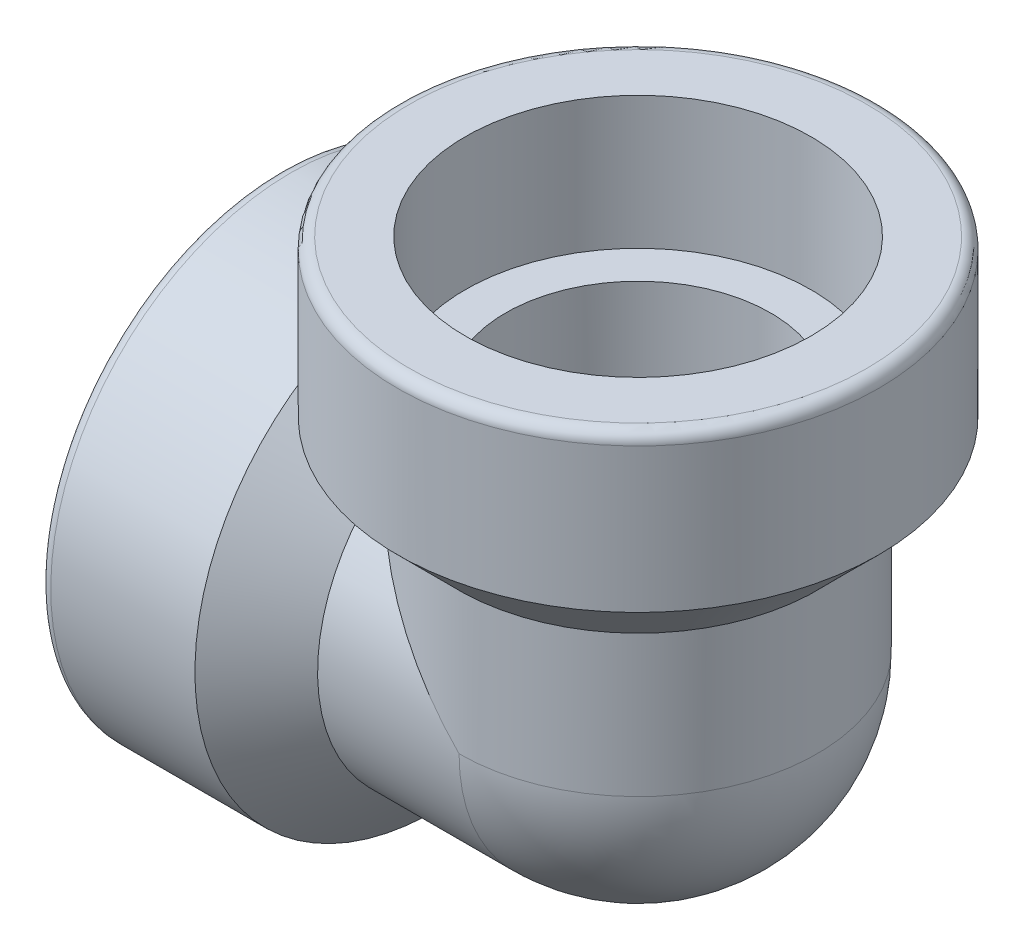
ISO-10303-21;
HEADER;
FILE_DESCRIPTION(('STEP AP214'),'2;1');
FILE_NAME('part.step','',(''),(''),'','','');
FILE_SCHEMA(('AUTOMOTIVE_DESIGN { 1 0 10303 214 1 1 1 1 }'));
ENDSEC;
DATA;
#1=APPLICATION_CONTEXT('core data for automotive mechanical design processes');
#2=APPLICATION_PROTOCOL_DEFINITION('international standard','automotive_design',2000,#1);
#3=PRODUCT_CONTEXT('',#1,'mechanical');
#4=PRODUCT('Part','Part','',(#3));
#5=PRODUCT_RELATED_PRODUCT_CATEGORY('part','',(#4));
#6=PRODUCT_DEFINITION_FORMATION('','',#4);
#7=PRODUCT_DEFINITION_CONTEXT('part definition',#1,'design');
#8=PRODUCT_DEFINITION('design','',#6,#7);
#9=PRODUCT_DEFINITION_SHAPE('','',#8);
#10=(LENGTH_UNIT() NAMED_UNIT(*) SI_UNIT(.MILLI.,.METRE.));
#11=(NAMED_UNIT(*) PLANE_ANGLE_UNIT() SI_UNIT($,.RADIAN.));
#12=(NAMED_UNIT(*) SI_UNIT($,.STERADIAN.) SOLID_ANGLE_UNIT());
#13=UNCERTAINTY_MEASURE_WITH_UNIT(LENGTH_MEASURE(1.E-05),#10,'distance_accuracy_value','');
#14=(GEOMETRIC_REPRESENTATION_CONTEXT(3) GLOBAL_UNCERTAINTY_ASSIGNED_CONTEXT((#13)) GLOBAL_UNIT_ASSIGNED_CONTEXT((#10,
#11,#12)) REPRESENTATION_CONTEXT('',''));
#15=CARTESIAN_POINT('',(0.,0.,0.));
#16=DIRECTION('',(0.,0.,1.));
#17=DIRECTION('',(1.,0.,0.));
#18=AXIS2_PLACEMENT_3D('',#15,#16,#17);
#19=CARTESIAN_POINT('',(0.,0.,0.));
#20=DIRECTION('',(1.,0.,0.));
#21=DIRECTION('',(0.,1.,0.));
#22=AXIS2_PLACEMENT_3D('',#19,#20,#21);
#23=CYLINDRICAL_SURFACE('',#22,23.495);
#24=CARTESIAN_POINT('',(-33.91535,0.,0.));
#25=DIRECTION('',(1.,0.,0.));
#26=DIRECTION('',(0.,1.,0.));
#27=AXIS2_PLACEMENT_3D('',#24,#25,#26);
#28=CIRCLE('',#27,23.495);
#29=CARTESIAN_POINT('',(-33.91535,23.495,0.));
#30=VERTEX_POINT('',#29);
#31=EDGE_CURVE('E232',#30,#30,#28,.T.);
#32=ORIENTED_EDGE('',*,*,#31,.T.);
#33=EDGE_LOOP('',(#32));
#34=FACE_BOUND('',#33,.T.);
#35=CARTESIAN_POINT('',(0.,0.,0.));
#36=DIRECTION('',(0.707106781186549,0.707106781186546,0.));
#37=DIRECTION('',(0.707106781186546,-0.707106781186549,0.));
#38=AXIS2_PLACEMENT_3D('',#35,#36,#37);
#39=ELLIPSE('',#38,33.2269476479558,23.495);
#40=CARTESIAN_POINT('',(-19.8247,19.8247,-12.6093732956875));
#41=VERTEX_POINT('',#40);
#42=CARTESIAN_POINT('',(-19.8247,19.824700000002,12.6093732956845));
#43=VERTEX_POINT('',#42);
#44=EDGE_CURVE('E98',#41,#43,#39,.T.);
#45=ORIENTED_EDGE('',*,*,#44,.F.);
#46=CARTESIAN_POINT('',(-19.8247,0.,0.));
#47=DIRECTION('',(1.,0.,0.));
#48=DIRECTION('',(0.,1.,0.));
#49=AXIS2_PLACEMENT_3D('',#46,#47,#48);
#50=CIRCLE('',#49,23.495);
#51=EDGE_CURVE('E235',#43,#41,#50,.T.);
#52=ORIENTED_EDGE('',*,*,#51,.F.);
#53=EDGE_LOOP('',(#45,#52));
#54=FACE_BOUND('',#53,.T.);
#55=ADVANCED_FACE('F84',(#34,#54),#23,.T.);
#56=CARTESIAN_POINT('',(-19.8247,0.,0.));
#57=DIRECTION('',(-1.,0.,0.));
#58=DIRECTION('',(0.,-1.,0.));
#59=AXIS2_PLACEMENT_3D('',#56,#57,#58);
#60=CONICAL_SURFACE('',#59,23.495,0.78539816339745);
#61=CARTESIAN_POINT('',(-13.8301,13.8301000000001,-10.7234478667077));
#62=CARTESIAN_POINT('',(-14.3275758626106,14.3275758626106,-10.8936867187958));
#63=CARTESIAN_POINT('',(-14.8256908691402,14.8256908691402,-11.0601533383311));
#64=CARTESIAN_POINT('',(-15.8229909550341,15.8229909550341,-11.3863126626173));
#65=CARTESIAN_POINT('',(-16.3221759531859,16.3221759531859,-11.5460058635909));
#66=CARTESIAN_POINT('',(-17.3214680583137,17.3214680583137,-11.8594096385888));
#67=CARTESIAN_POINT('',(-17.8215751413089,17.8215751413089,-12.0131203659639));
#68=CARTESIAN_POINT('',(-18.8226394264934,18.8226394264934,-12.315164638502));
#69=CARTESIAN_POINT('',(-19.3235966882929,19.3235966882929,-12.4634977888065));
#70=CARTESIAN_POINT('',(-19.8249000000001,19.8249000000001,-12.6094315109761));
#71=B_SPLINE_CURVE_WITH_KNOTS('',3,(#61,#62,#63,#64,#65,#66,#67,#68,#69,#70),.UNSPECIFIED.,.F.,
.F.,(4,2,2,2,4),(0.,2.17150001962585,4.34284067873014,6.51412564241125,8.6855697150797),.UNSPECIFIED.);
#72=CARTESIAN_POINT('',(-13.8303,13.8303,-10.7235163202188));
#73=VERTEX_POINT('',#72);
#74=EDGE_CURVE('E169',#73,#41,#71,.T.);
#75=ORIENTED_EDGE('',*,*,#74,.F.);
#76=CARTESIAN_POINT('',(-13.8303,0.,0.));
#77=DIRECTION('',(1.,0.,0.));
#78=DIRECTION('',(0.,1.,0.));
#79=AXIS2_PLACEMENT_3D('',#76,#77,#78);
#80=CIRCLE('',#79,17.5006);
#81=CARTESIAN_POINT('',(-13.8303,13.8303,10.7235163202188));
#82=VERTEX_POINT('',#81);
#83=EDGE_CURVE('E143',#82,#73,#80,.T.);
#84=ORIENTED_EDGE('',*,*,#83,.F.);
#85=CARTESIAN_POINT('',(-19.8249000000001,19.8249000000001,12.6094315109761));
#86=CARTESIAN_POINT('',(-19.3235966882929,19.3235966882929,12.4634977888065));
#87=CARTESIAN_POINT('',(-18.8226394264934,18.8226394264935,12.315164638502));
#88=CARTESIAN_POINT('',(-17.8215751413089,17.8215751413089,12.0131203659639));
#89=CARTESIAN_POINT('',(-17.3214680583137,17.3214680583137,11.8594096385888));
#90=CARTESIAN_POINT('',(-16.3221759531859,16.3221759531859,11.5460058635909));
#91=CARTESIAN_POINT('',(-15.8229909550341,15.8229909550341,11.3863126626172));
#92=CARTESIAN_POINT('',(-14.8256908691402,14.8256908691402,11.0601533383311));
#93=CARTESIAN_POINT('',(-14.3275758626106,14.3275758626106,10.8936867187958));
#94=CARTESIAN_POINT('',(-13.8301,13.8301000000001,10.7234478667077));
#95=B_SPLINE_CURVE_WITH_KNOTS('',3,(#85,#86,#87,#88,#89,#90,#91,#92,#93,#94),.UNSPECIFIED.,.F.,
.F.,(4,2,2,2,4),(0.,2.17144407266845,4.34272903634957,6.51406969545385,8.68556971507971),.UNSPECIFIED.);
#96=EDGE_CURVE('E105',#43,#82,#95,.T.);
#97=ORIENTED_EDGE('',*,*,#96,.F.);
#98=ORIENTED_EDGE('',*,*,#51,.T.);
#99=EDGE_LOOP('',(#75,#84,#97,#98));
#100=FACE_BOUND('',#99,.T.);
#101=ADVANCED_FACE('F174',(#100),#60,.T.);
#102=CARTESIAN_POINT('',(0.,0.,0.));
#103=DIRECTION('',(1.,0.,0.));
#104=DIRECTION('',(0.,1.,0.));
#105=AXIS2_PLACEMENT_3D('',#102,#103,#104);
#106=CYLINDRICAL_SURFACE('',#105,17.5006);
#107=CARTESIAN_POINT('',(0.,0.,0.));
#108=DIRECTION('',(0.707106781186549,0.707106781186546,0.));
#109=DIRECTION('',(0.707106781186546,-0.707106781186549,0.));
#110=AXIS2_PLACEMENT_3D('',#107,#108,#109);
#111=ELLIPSE('',#110,24.7495858696665,17.5006);
#112=CARTESIAN_POINT('',(0.,0.,-17.5006));
#113=VERTEX_POINT('',#112);
#114=EDGE_CURVE('E137',#113,#73,#111,.T.);
#115=ORIENTED_EDGE('',*,*,#114,.F.);
#116=CARTESIAN_POINT('',(0.,0.,0.));
#117=DIRECTION('',(1.,0.,0.));
#118=DIRECTION('',(0.,1.,0.));
#119=AXIS2_PLACEMENT_3D('',#116,#117,#118);
#120=CIRCLE('',#119,17.5006);
#121=CARTESIAN_POINT('',(0.,0.,17.5006));
#122=VERTEX_POINT('',#121);
#123=EDGE_CURVE('E140',#122,#113,#120,.T.);
#124=ORIENTED_EDGE('',*,*,#123,.F.);
#125=EDGE_CURVE('E126',#82,#122,#111,.T.);
#126=ORIENTED_EDGE('',*,*,#125,.F.);
#127=ORIENTED_EDGE('',*,*,#83,.T.);
#128=EDGE_LOOP('',(#115,#124,#126,#127));
#129=FACE_BOUND('',#128,.T.);
#130=ADVANCED_FACE('F141',(#129),#106,.T.);
#131=CARTESIAN_POINT('',(-35.052,-16.891,0.));
#132=DIRECTION('',(1.,0.,0.));
#133=DIRECTION('',(0.,1.,0.));
#134=AXIS2_PLACEMENT_3D('',#131,#132,#133);
#135=PLANE('',#134);
#136=CARTESIAN_POINT('',(-35.052,0.,0.));
#137=DIRECTION('',(1.,0.,0.));
#138=DIRECTION('',(0.,1.,0.));
#139=AXIS2_PLACEMENT_3D('',#136,#137,#138);
#140=CIRCLE('',#139,22.35835);
#141=CARTESIAN_POINT('',(-35.052,22.35835,0.));
#142=VERTEX_POINT('',#141);
#143=EDGE_CURVE('E92',#142,#142,#140,.T.);
#144=ORIENTED_EDGE('',*,*,#143,.F.);
#145=EDGE_LOOP('',(#144));
#146=FACE_BOUND('',#145,.T.);
#147=CARTESIAN_POINT('',(-35.052,0.,0.));
#148=DIRECTION('',(1.,0.,0.));
#149=DIRECTION('',(0.,1.,0.));
#150=AXIS2_PLACEMENT_3D('',#147,#148,#149);
#151=CIRCLE('',#150,16.891);
#152=CARTESIAN_POINT('',(-35.052,16.891,0.));
#153=VERTEX_POINT('',#152);
#154=EDGE_CURVE('E248',#153,#153,#151,.T.);
#155=ORIENTED_EDGE('',*,*,#154,.T.);
#156=EDGE_LOOP('',(#155));
#157=FACE_BOUND('',#156,.T.);
#158=ADVANCED_FACE('F86',(#146,#157),#135,.F.);
#159=CARTESIAN_POINT('',(-33.91535,0.,0.));
#160=DIRECTION('',(1.,0.,0.));
#161=DIRECTION('',(0.,1.,0.));
#162=AXIS2_PLACEMENT_3D('',#159,#160,#161);
#163=TOROIDAL_SURFACE('',#162,22.35835,1.13665000000001);
#164=ORIENTED_EDGE('',*,*,#31,.F.);
#165=EDGE_LOOP('',(#164));
#166=FACE_BOUND('',#165,.T.);
#167=ORIENTED_EDGE('',*,*,#143,.T.);
#168=EDGE_LOOP('',(#167));
#169=FACE_BOUND('',#168,.T.);
#170=ADVANCED_FACE('F213',(#166,#169),#163,.T.);
#171=CARTESIAN_POINT('',(0.,0.,0.));
#172=DIRECTION('',(1.,0.,0.));
#173=DIRECTION('',(0.,1.,0.));
#174=AXIS2_PLACEMENT_3D('',#171,#172,#173);
#175=CYLINDRICAL_SURFACE('',#174,12.954);
#176=CARTESIAN_POINT('',(0.,0.,0.));
#177=DIRECTION('',(0.707106781186549,0.707106781186546,0.));
#178=DIRECTION('',(0.707106781186546,-0.707106781186549,0.));
#179=AXIS2_PLACEMENT_3D('',#176,#177,#178);
#180=ELLIPSE('',#179,18.319722486981,12.954);
#181=CARTESIAN_POINT('',(0.,0.,-12.954));
#182=VERTEX_POINT('',#181);
#183=CARTESIAN_POINT('',(0.,0.,12.954));
#184=VERTEX_POINT('',#183);
#185=EDGE_CURVE('E12',#182,#184,#180,.T.);
#186=ORIENTED_EDGE('',*,*,#185,.T.);
#187=CARTESIAN_POINT('',(0.,0.,0.));
#188=DIRECTION('',(1.,0.,0.));
#189=DIRECTION('',(0.,1.,0.));
#190=AXIS2_PLACEMENT_3D('',#187,#188,#189);
#191=CIRCLE('',#190,12.954);
#192=EDGE_CURVE('E144',#184,#182,#191,.T.);
#193=ORIENTED_EDGE('',*,*,#192,.T.);
#194=EDGE_LOOP('',(#186,#193));
#195=FACE_BOUND('',#194,.T.);
#196=CARTESIAN_POINT('',(-22.098,0.,0.));
#197=DIRECTION('',(1.,0.,0.));
#198=DIRECTION('',(0.,1.,0.));
#199=AXIS2_PLACEMENT_3D('',#196,#197,#198);
#200=CIRCLE('',#199,12.954);
#201=CARTESIAN_POINT('',(-22.098,12.954,0.));
#202=VERTEX_POINT('',#201);
#203=EDGE_CURVE('E242',#202,#202,#200,.T.);
#204=ORIENTED_EDGE('',*,*,#203,.F.);
#205=EDGE_LOOP('',(#204));
#206=FACE_BOUND('',#205,.T.);
#207=ADVANCED_FACE('F210',(#195,#206),#175,.F.);
#208=CARTESIAN_POINT('',(-22.098,-16.891,0.));
#209=DIRECTION('',(1.,0.,0.));
#210=DIRECTION('',(0.,1.,0.));
#211=AXIS2_PLACEMENT_3D('',#208,#209,#210);
#212=PLANE('',#211);
#213=CARTESIAN_POINT('',(-22.098,0.,0.));
#214=DIRECTION('',(1.,0.,0.));
#215=DIRECTION('',(0.,1.,0.));
#216=AXIS2_PLACEMENT_3D('',#213,#214,#215);
#217=CIRCLE('',#216,16.891);
#218=CARTESIAN_POINT('',(-22.098,16.891,0.));
#219=VERTEX_POINT('',#218);
#220=EDGE_CURVE('E245',#219,#219,#217,.T.);
#221=ORIENTED_EDGE('',*,*,#220,.F.);
#222=EDGE_LOOP('',(#221));
#223=FACE_BOUND('',#222,.T.);
#224=ORIENTED_EDGE('',*,*,#203,.T.);
#225=EDGE_LOOP('',(#224));
#226=FACE_BOUND('',#225,.T.);
#227=ADVANCED_FACE('F206',(#223,#226),#212,.F.);
#228=CARTESIAN_POINT('',(0.,0.,0.));
#229=DIRECTION('',(1.,0.,0.));
#230=DIRECTION('',(0.,1.,0.));
#231=AXIS2_PLACEMENT_3D('',#228,#229,#230);
#232=CYLINDRICAL_SURFACE('',#231,16.891);
#233=ORIENTED_EDGE('',*,*,#154,.F.);
#234=EDGE_LOOP('',(#233));
#235=FACE_BOUND('',#234,.T.);
#236=ORIENTED_EDGE('',*,*,#220,.T.);
#237=EDGE_LOOP('',(#236));
#238=FACE_BOUND('',#237,.T.);
#239=ADVANCED_FACE('F202',(#235,#238),#232,.F.);
#240=CARTESIAN_POINT('',(1.16888437002832E-13,35.052,0.));
#241=DIRECTION('',(0.,-1.,0.));
#242=DIRECTION('',(1.,0.,0.));
#243=AXIS2_PLACEMENT_3D('',#240,#241,#242);
#244=CYLINDRICAL_SURFACE('',#243,12.954);
#245=ORIENTED_EDGE('',*,*,#185,.F.);
#246=CARTESIAN_POINT('',(0.,0.,0.));
#247=DIRECTION('',(0.,-1.,0.));
#248=DIRECTION('',(1.,0.,0.));
#249=AXIS2_PLACEMENT_3D('',#246,#247,#248);
#250=CIRCLE('',#249,12.954);
#251=EDGE_CURVE('E147',#182,#184,#250,.T.);
#252=ORIENTED_EDGE('',*,*,#251,.T.);
#253=EDGE_LOOP('',(#245,#252));
#254=FACE_BOUND('',#253,.T.);
#255=CARTESIAN_POINT('',(0.,22.098,0.));
#256=DIRECTION('',(0.,-1.,0.));
#257=DIRECTION('',(1.,0.,0.));
#258=AXIS2_PLACEMENT_3D('',#255,#256,#257);
#259=CIRCLE('',#258,12.954);
#260=CARTESIAN_POINT('',(12.9540000000001,22.0979999999999,0.));
#261=VERTEX_POINT('',#260);
#262=EDGE_CURVE('E152',#261,#261,#259,.T.);
#263=ORIENTED_EDGE('',*,*,#262,.F.);
#264=EDGE_LOOP('',(#263));
#265=FACE_BOUND('',#264,.T.);
#266=ADVANCED_FACE('F189',(#254,#265),#244,.F.);
#267=CARTESIAN_POINT('',(0.,0.,0.));
#268=DIRECTION('',(0.,-1.,0.));
#269=DIRECTION('',(1.,0.,0.));
#270=AXIS2_PLACEMENT_3D('',#267,#268,#269);
#271=CYLINDRICAL_SURFACE('',#270,23.495);
#272=CARTESIAN_POINT('',(1.14036436495777E-13,33.91535,0.));
#273=DIRECTION('',(0.,-1.,0.));
#274=DIRECTION('',(1.,0.,0.));
#275=AXIS2_PLACEMENT_3D('',#272,#273,#274);
#276=CIRCLE('',#275,23.495);
#277=CARTESIAN_POINT('',(23.4950000000001,33.9153499999999,0.));
#278=VERTEX_POINT('',#277);
#279=EDGE_CURVE('E158',#278,#278,#276,.T.);
#280=ORIENTED_EDGE('',*,*,#279,.T.);
#281=EDGE_LOOP('',(#280));
#282=FACE_BOUND('',#281,.T.);
#283=CARTESIAN_POINT('',(0.,19.8247,0.));
#284=DIRECTION('',(0.,-1.,0.));
#285=DIRECTION('',(1.,0.,0.));
#286=AXIS2_PLACEMENT_3D('',#283,#284,#285);
#287=CIRCLE('',#286,23.495);
#288=EDGE_CURVE('E149',#41,#43,#287,.T.);
#289=ORIENTED_EDGE('',*,*,#288,.F.);
#290=ORIENTED_EDGE('',*,*,#44,.T.);
#291=EDGE_LOOP('',(#289,#290));
#292=FACE_BOUND('',#291,.T.);
#293=ADVANCED_FACE('F183',(#282,#292),#271,.T.);
#294=CARTESIAN_POINT('',(0.,19.8247,0.));
#295=DIRECTION('',(0.,1.,0.));
#296=DIRECTION('',(-1.,0.,0.));
#297=AXIS2_PLACEMENT_3D('',#294,#295,#296);
#298=CONICAL_SURFACE('',#297,23.495,0.78539816339745);
#299=CARTESIAN_POINT('',(0.,13.8303,0.));
#300=DIRECTION('',(0.,-1.,0.));
#301=DIRECTION('',(1.,0.,0.));
#302=AXIS2_PLACEMENT_3D('',#299,#300,#301);
#303=CIRCLE('',#302,17.5006);
#304=EDGE_CURVE('E134',#73,#82,#303,.T.);
#305=ORIENTED_EDGE('',*,*,#304,.F.);
#306=ORIENTED_EDGE('',*,*,#74,.T.);
#307=ORIENTED_EDGE('',*,*,#288,.T.);
#308=ORIENTED_EDGE('',*,*,#96,.T.);
#309=EDGE_LOOP('',(#305,#306,#307,#308));
#310=FACE_BOUND('',#309,.T.);
#311=ADVANCED_FACE('F178',(#310),#298,.T.);
#312=CARTESIAN_POINT('',(0.,0.,0.));
#313=DIRECTION('',(0.,-1.,0.));
#314=DIRECTION('',(1.,0.,0.));
#315=AXIS2_PLACEMENT_3D('',#312,#313,#314);
#316=CYLINDRICAL_SURFACE('',#315,17.5006);
#317=CARTESIAN_POINT('',(0.,0.,0.));
#318=DIRECTION('',(0.,-1.,0.));
#319=DIRECTION('',(1.,0.,0.));
#320=AXIS2_PLACEMENT_3D('',#317,#318,#319);
#321=CIRCLE('',#320,17.5006);
#322=EDGE_CURVE('E131',#113,#122,#321,.T.);
#323=ORIENTED_EDGE('',*,*,#322,.F.);
#324=ORIENTED_EDGE('',*,*,#114,.T.);
#325=ORIENTED_EDGE('',*,*,#304,.T.);
#326=ORIENTED_EDGE('',*,*,#125,.T.);
#327=EDGE_LOOP('',(#323,#324,#325,#326));
#328=FACE_BOUND('',#327,.T.);
#329=ADVANCED_FACE('F128',(#328),#316,.T.);
#330=CARTESIAN_POINT('',(-16.8909999999999,35.0520000000001,0.));
#331=DIRECTION('',(0.,-1.,0.));
#332=DIRECTION('',(1.,0.,0.));
#333=AXIS2_PLACEMENT_3D('',#330,#331,#332);
#334=PLANE('',#333);
#335=CARTESIAN_POINT('',(1.18090842813235E-13,35.052,0.));
#336=DIRECTION('',(0.,-1.,0.));
#337=DIRECTION('',(1.,0.,0.));
#338=AXIS2_PLACEMENT_3D('',#335,#336,#337);
#339=CIRCLE('',#338,22.35835);
#340=CARTESIAN_POINT('',(22.3583500000001,35.0519999999999,0.));
#341=VERTEX_POINT('',#340);
#342=EDGE_CURVE('E138',#341,#341,#339,.T.);
#343=ORIENTED_EDGE('',*,*,#342,.F.);
#344=EDGE_LOOP('',(#343));
#345=FACE_BOUND('',#344,.T.);
#346=CARTESIAN_POINT('',(1.18090842813235E-13,35.052,0.));
#347=DIRECTION('',(0.,-1.,0.));
#348=DIRECTION('',(1.,0.,0.));
#349=AXIS2_PLACEMENT_3D('',#346,#347,#348);
#350=CIRCLE('',#349,16.891);
#351=CARTESIAN_POINT('',(16.8910000000001,35.0519999999999,0.));
#352=VERTEX_POINT('',#351);
#353=EDGE_CURVE('E269',#352,#352,#350,.T.);
#354=ORIENTED_EDGE('',*,*,#353,.T.);
#355=EDGE_LOOP('',(#354));
#356=FACE_BOUND('',#355,.T.);
#357=ADVANCED_FACE('F195',(#345,#356),#334,.F.);
#358=CARTESIAN_POINT('',(1.14945433259247E-13,33.91535,0.));
#359=DIRECTION('',(0.,-1.,0.));
#360=DIRECTION('',(1.,0.,0.));
#361=AXIS2_PLACEMENT_3D('',#358,#359,#360);
#362=TOROIDAL_SURFACE('',#361,22.35835,1.13665000000001);
#363=ORIENTED_EDGE('',*,*,#279,.F.);
#364=EDGE_LOOP('',(#363));
#365=FACE_BOUND('',#364,.T.);
#366=ORIENTED_EDGE('',*,*,#342,.T.);
#367=EDGE_LOOP('',(#366));
#368=FACE_BOUND('',#367,.T.);
#369=ADVANCED_FACE('F191',(#365,#368),#362,.T.);
#370=CARTESIAN_POINT('',(-16.8909999999999,22.098,0.));
#371=DIRECTION('',(0.,-1.,0.));
#372=DIRECTION('',(1.,0.,0.));
#373=AXIS2_PLACEMENT_3D('',#370,#371,#372);
#374=PLANE('',#373);
#375=CARTESIAN_POINT('',(0.,22.098,0.));
#376=DIRECTION('',(0.,-1.,0.));
#377=DIRECTION('',(1.,0.,0.));
#378=AXIS2_PLACEMENT_3D('',#375,#376,#377);
#379=CIRCLE('',#378,16.891);
#380=CARTESIAN_POINT('',(16.8910000000001,22.0979999999999,0.));
#381=VERTEX_POINT('',#380);
#382=EDGE_CURVE('E267',#381,#381,#379,.T.);
#383=ORIENTED_EDGE('',*,*,#382,.F.);
#384=EDGE_LOOP('',(#383));
#385=FACE_BOUND('',#384,.T.);
#386=ORIENTED_EDGE('',*,*,#262,.T.);
#387=EDGE_LOOP('',(#386));
#388=FACE_BOUND('',#387,.T.);
#389=ADVANCED_FACE('F194',(#385,#388),#374,.F.);
#390=CARTESIAN_POINT('',(0.,0.,0.));
#391=DIRECTION('',(0.,-1.,0.));
#392=DIRECTION('',(1.,0.,0.));
#393=AXIS2_PLACEMENT_3D('',#390,#391,#392);
#394=CYLINDRICAL_SURFACE('',#393,16.891);
#395=ORIENTED_EDGE('',*,*,#353,.F.);
#396=EDGE_LOOP('',(#395));
#397=FACE_BOUND('',#396,.T.);
#398=ORIENTED_EDGE('',*,*,#382,.T.);
#399=EDGE_LOOP('',(#398));
#400=FACE_BOUND('',#399,.T.);
#401=ADVANCED_FACE('F276',(#397,#400),#394,.F.);
#402=CARTESIAN_POINT('',(0.,0.,0.));
#403=DIRECTION('',(0.,0.,-1.));
#404=DIRECTION('',(-1.,0.,0.));
#405=AXIS2_PLACEMENT_3D('',#402,#403,#404);
#406=SPHERICAL_SURFACE('',#405,17.5006);
#407=ORIENTED_EDGE('',*,*,#123,.T.);
#408=ORIENTED_EDGE('',*,*,#322,.T.);
#409=EDGE_LOOP('',(#407,#408));
#410=FACE_BOUND('',#409,.T.);
#411=ADVANCED_FACE('F146',(#410),#406,.T.);
#412=CARTESIAN_POINT('',(0.,0.,0.));
#413=DIRECTION('',(0.,0.,-1.));
#414=DIRECTION('',(-1.,0.,0.));
#415=AXIS2_PLACEMENT_3D('',#412,#413,#414);
#416=SPHERICAL_SURFACE('',#415,12.954);
#417=ORIENTED_EDGE('',*,*,#192,.F.);
#418=ORIENTED_EDGE('',*,*,#251,.F.);
#419=EDGE_LOOP('',(#417,#418));
#420=FACE_BOUND('',#419,.T.);
#421=ADVANCED_FACE('F262',(#420),#416,.F.);
#422=CLOSED_SHELL('',(#55,#101,#130,#158,#170,#207,#227,#239,#266,#293,#311,#329,#357,#369,#389,
#401,#411,#421));
#423=MANIFOLD_SOLID_BREP('B2',#422);
#424=ADVANCED_BREP_SHAPE_REPRESENTATION('',(#18,#423),#14);
#425=SHAPE_DEFINITION_REPRESENTATION(#9,#424);
ENDSEC;
END-ISO-10303-21;
